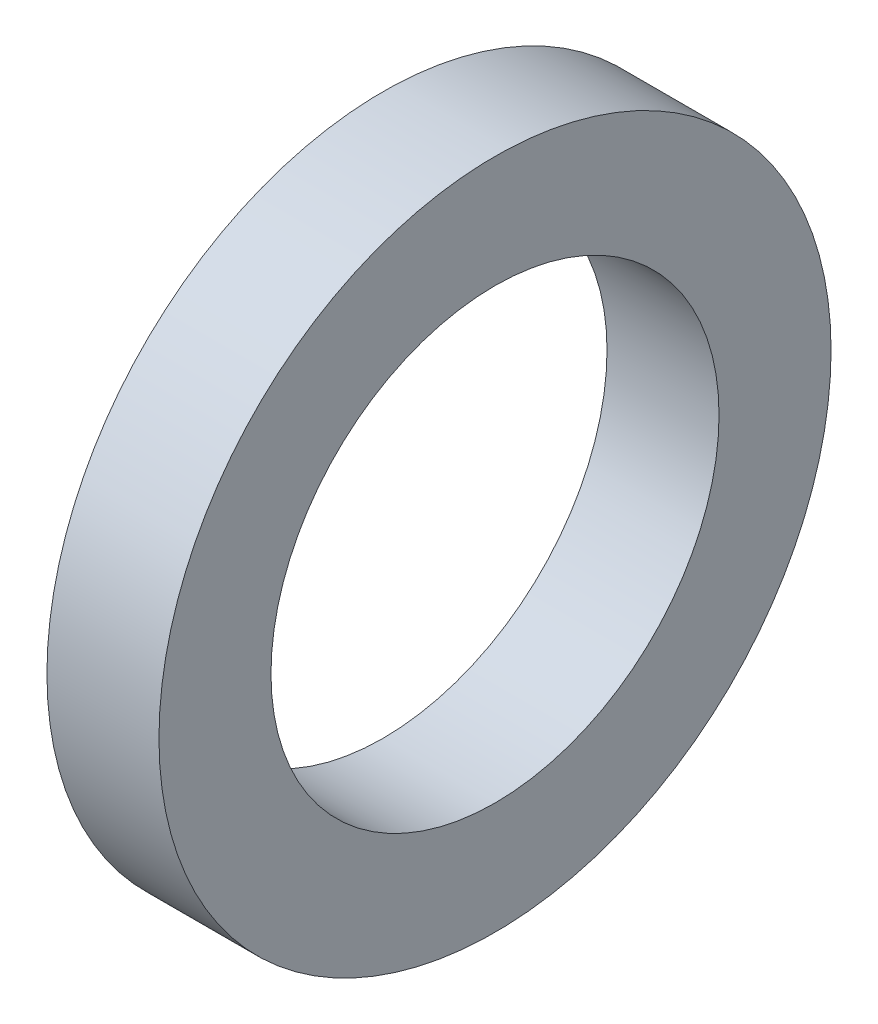
ISO-10303-21;
HEADER;
FILE_DESCRIPTION(('STEP AP214'),'2;1');
FILE_NAME('part.step','',(''),(''),'','','');
FILE_SCHEMA(('AUTOMOTIVE_DESIGN { 1 0 10303 214 1 1 1 1 }'));
ENDSEC;
DATA;
#1=APPLICATION_CONTEXT('core data for automotive mechanical design processes');
#2=APPLICATION_PROTOCOL_DEFINITION('international standard','automotive_design',2000,#1);
#3=PRODUCT_CONTEXT('',#1,'mechanical');
#4=PRODUCT('Part','Part','',(#3));
#5=PRODUCT_RELATED_PRODUCT_CATEGORY('part','',(#4));
#6=PRODUCT_DEFINITION_FORMATION('','',#4);
#7=PRODUCT_DEFINITION_CONTEXT('part definition',#1,'design');
#8=PRODUCT_DEFINITION('design','',#6,#7);
#9=PRODUCT_DEFINITION_SHAPE('','',#8);
#10=(LENGTH_UNIT() NAMED_UNIT(*) SI_UNIT(.MILLI.,.METRE.));
#11=(NAMED_UNIT(*) PLANE_ANGLE_UNIT() SI_UNIT($,.RADIAN.));
#12=(NAMED_UNIT(*) SI_UNIT($,.STERADIAN.) SOLID_ANGLE_UNIT());
#13=UNCERTAINTY_MEASURE_WITH_UNIT(LENGTH_MEASURE(1.E-05),#10,'distance_accuracy_value','');
#14=(GEOMETRIC_REPRESENTATION_CONTEXT(3) GLOBAL_UNCERTAINTY_ASSIGNED_CONTEXT((#13)) GLOBAL_UNIT_ASSIGNED_CONTEXT((#10,
#11,#12)) REPRESENTATION_CONTEXT('',''));
#15=CARTESIAN_POINT('',(0.,0.,0.));
#16=DIRECTION('',(0.,0.,1.));
#17=DIRECTION('',(1.,0.,0.));
#18=AXIS2_PLACEMENT_3D('',#15,#16,#17);
#19=CARTESIAN_POINT('',(1.,0.,0.));
#20=DIRECTION('',(1.,0.,0.));
#21=DIRECTION('',(0.,0.,-1.));
#22=AXIS2_PLACEMENT_3D('',#19,#20,#21);
#23=PLANE('',#22);
#24=CARTESIAN_POINT('',(1.,0.,0.));
#25=DIRECTION('',(1.,0.,0.));
#26=DIRECTION('',(0.,0.,-1.));
#27=AXIS2_PLACEMENT_3D('',#24,#25,#26);
#28=CIRCLE('',#27,3.);
#29=CARTESIAN_POINT('',(1.,0.,-3.));
#30=VERTEX_POINT('',#29);
#31=EDGE_CURVE('E10',#30,#30,#28,.T.);
#32=ORIENTED_EDGE('',*,*,#31,.T.);
#33=EDGE_LOOP('',(#32));
#34=FACE_BOUND('',#33,.T.);
#35=CARTESIAN_POINT('',(1.,0.,0.));
#36=DIRECTION('',(1.,0.,0.));
#37=DIRECTION('',(0.,0.,-1.));
#38=AXIS2_PLACEMENT_3D('',#35,#36,#37);
#39=CIRCLE('',#38,2.);
#40=CARTESIAN_POINT('',(1.,0.,-2.));
#41=VERTEX_POINT('',#40);
#42=EDGE_CURVE('E42',#41,#41,#39,.T.);
#43=ORIENTED_EDGE('',*,*,#42,.F.);
#44=EDGE_LOOP('',(#43));
#45=FACE_BOUND('',#44,.T.);
#46=ADVANCED_FACE('F31',(#34,#45),#23,.T.);
#47=CARTESIAN_POINT('',(0.,0.,0.));
#48=DIRECTION('',(1.,0.,0.));
#49=DIRECTION('',(0.,0.,-1.));
#50=AXIS2_PLACEMENT_3D('',#47,#48,#49);
#51=PLANE('',#50);
#52=CARTESIAN_POINT('',(0.,0.,0.));
#53=DIRECTION('',(1.,0.,0.));
#54=DIRECTION('',(0.,0.,-1.));
#55=AXIS2_PLACEMENT_3D('',#52,#53,#54);
#56=CIRCLE('',#55,3.);
#57=CARTESIAN_POINT('',(0.,0.,-3.));
#58=VERTEX_POINT('',#57);
#59=EDGE_CURVE('E35',#58,#58,#56,.T.);
#60=ORIENTED_EDGE('',*,*,#59,.F.);
#61=EDGE_LOOP('',(#60));
#62=FACE_BOUND('',#61,.T.);
#63=CARTESIAN_POINT('',(0.,0.,0.));
#64=DIRECTION('',(1.,0.,0.));
#65=DIRECTION('',(0.,0.,-1.));
#66=AXIS2_PLACEMENT_3D('',#63,#64,#65);
#67=CIRCLE('',#66,2.);
#68=CARTESIAN_POINT('',(0.,0.,-2.));
#69=VERTEX_POINT('',#68);
#70=EDGE_CURVE('E44',#69,#69,#67,.T.);
#71=ORIENTED_EDGE('',*,*,#70,.T.);
#72=EDGE_LOOP('',(#71));
#73=FACE_BOUND('',#72,.T.);
#74=ADVANCED_FACE('F54',(#62,#73),#51,.F.);
#75=CARTESIAN_POINT('',(1.,0.,0.));
#76=DIRECTION('',(-1.,0.,0.));
#77=DIRECTION('',(0.,0.,1.));
#78=AXIS2_PLACEMENT_3D('',#75,#76,#77);
#79=CYLINDRICAL_SURFACE('',#78,3.);
#80=ORIENTED_EDGE('',*,*,#31,.F.);
#81=EDGE_LOOP('',(#80));
#82=FACE_BOUND('',#81,.T.);
#83=ORIENTED_EDGE('',*,*,#59,.T.);
#84=EDGE_LOOP('',(#83));
#85=FACE_BOUND('',#84,.T.);
#86=ADVANCED_FACE('F33',(#82,#85),#79,.T.);
#87=CARTESIAN_POINT('',(1.,0.,0.));
#88=DIRECTION('',(-1.,0.,0.));
#89=DIRECTION('',(0.,0.,1.));
#90=AXIS2_PLACEMENT_3D('',#87,#88,#89);
#91=CYLINDRICAL_SURFACE('',#90,2.);
#92=ORIENTED_EDGE('',*,*,#42,.T.);
#93=EDGE_LOOP('',(#92));
#94=FACE_BOUND('',#93,.T.);
#95=ORIENTED_EDGE('',*,*,#70,.F.);
#96=EDGE_LOOP('',(#95));
#97=FACE_BOUND('',#96,.T.);
#98=ADVANCED_FACE('F50',(#94,#97),#91,.F.);
#99=CLOSED_SHELL('',(#46,#74,#86,#98));
#100=MANIFOLD_SOLID_BREP('B2',#99);
#101=ADVANCED_BREP_SHAPE_REPRESENTATION('',(#18,#100),#14);
#102=SHAPE_DEFINITION_REPRESENTATION(#9,#101);
ENDSEC;
END-ISO-10303-21;
